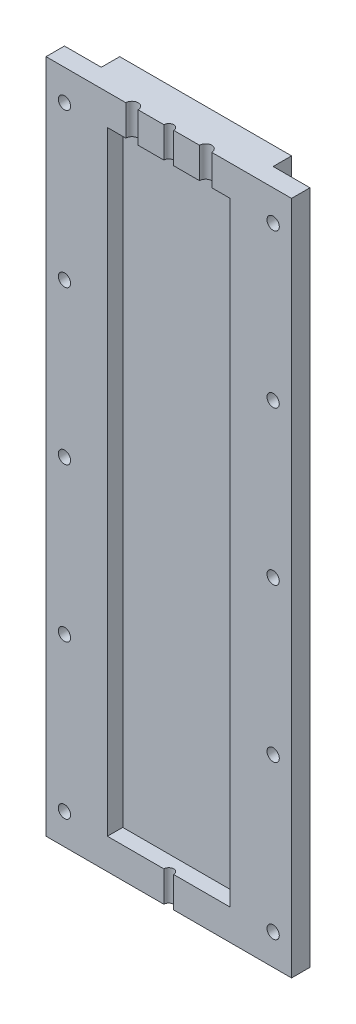
ISO-10303-21;
HEADER;
FILE_DESCRIPTION(('STEP AP214'),'2;1');
FILE_NAME('part.step','',(''),(''),'','','');
FILE_SCHEMA(('AUTOMOTIVE_DESIGN { 1 0 10303 214 1 1 1 1 }'));
ENDSEC;
DATA;
#1=APPLICATION_CONTEXT('core data for automotive mechanical design processes');
#2=APPLICATION_PROTOCOL_DEFINITION('international standard','automotive_design',2000,#1);
#3=PRODUCT_CONTEXT('',#1,'mechanical');
#4=PRODUCT('Part','Part','',(#3));
#5=PRODUCT_RELATED_PRODUCT_CATEGORY('part','',(#4));
#6=PRODUCT_DEFINITION_FORMATION('','',#4);
#7=PRODUCT_DEFINITION_CONTEXT('part definition',#1,'design');
#8=PRODUCT_DEFINITION('design','',#6,#7);
#9=PRODUCT_DEFINITION_SHAPE('','',#8);
#10=(LENGTH_UNIT() NAMED_UNIT(*) SI_UNIT(.MILLI.,.METRE.));
#11=(NAMED_UNIT(*) PLANE_ANGLE_UNIT() SI_UNIT($,.RADIAN.));
#12=(NAMED_UNIT(*) SI_UNIT($,.STERADIAN.) SOLID_ANGLE_UNIT());
#13=UNCERTAINTY_MEASURE_WITH_UNIT(LENGTH_MEASURE(1.E-05),#10,'distance_accuracy_value','');
#14=(GEOMETRIC_REPRESENTATION_CONTEXT(3) GLOBAL_UNCERTAINTY_ASSIGNED_CONTEXT((#13)) GLOBAL_UNIT_ASSIGNED_CONTEXT((#10,
#11,#12)) REPRESENTATION_CONTEXT('',''));
#15=CARTESIAN_POINT('',(0.,0.,0.));
#16=DIRECTION('',(0.,0.,1.));
#17=DIRECTION('',(1.,0.,0.));
#18=AXIS2_PLACEMENT_3D('',#15,#16,#17);
#19=CARTESIAN_POINT('',(14.,105.,0.));
#20=DIRECTION('',(0.,0.,-1.));
#21=DIRECTION('',(-1.,0.,0.));
#22=AXIS2_PLACEMENT_3D('',#19,#20,#21);
#23=PLANE('',#22);
#24=DIRECTION('',(1.,0.,0.));
#25=VECTOR('',#24,1.);
#26=CARTESIAN_POINT('',(20.,105.,0.));
#27=LINE('',#26,#25);
#28=CARTESIAN_POINT('',(0.8,105.,0.));
#29=VERTEX_POINT('',#28);
#30=CARTESIAN_POINT('',(5.,105.,0.));
#31=VERTEX_POINT('',#30);
#32=EDGE_CURVE('E207',#29,#31,#27,.T.);
#33=ORIENTED_EDGE('',*,*,#32,.T.);
#34=DIRECTION('',(0.,1.,0.));
#35=VECTOR('',#34,1.);
#36=CARTESIAN_POINT('',(5.,105.,0.));
#37=LINE('',#36,#35);
#38=CARTESIAN_POINT('',(5.,110.,0.));
#39=VERTEX_POINT('',#38);
#40=EDGE_CURVE('E183',#31,#39,#37,.T.);
#41=ORIENTED_EDGE('',*,*,#40,.T.);
#42=DIRECTION('',(1.,0.,0.));
#43=VECTOR('',#42,1.);
#44=CARTESIAN_POINT('',(10.,110.,0.));
#45=LINE('',#44,#43);
#46=CARTESIAN_POINT('',(0.8,110.,0.));
#47=VERTEX_POINT('',#46);
#48=EDGE_CURVE('E395',#47,#39,#45,.T.);
#49=ORIENTED_EDGE('',*,*,#48,.F.);
#50=DIRECTION('',(0.,-1.,0.));
#51=VECTOR('',#50,1.);
#52=CARTESIAN_POINT('',(0.8,110.,0.));
#53=LINE('',#52,#51);
#54=EDGE_CURVE('E227',#47,#29,#53,.T.);
#55=ORIENTED_EDGE('',*,*,#54,.T.);
#56=EDGE_LOOP('',(#33,#41,#49,#55));
#57=FACE_BOUND('',#56,.T.);
#58=ADVANCED_FACE('F45',(#57),#23,.F.);
#59=CARTESIAN_POINT('',(-17.0000000000003,105.,0.));
#60=DIRECTION('',(0.,0.,-1.));
#61=DIRECTION('',(-1.,0.,0.));
#62=AXIS2_PLACEMENT_3D('',#59,#60,#61);
#63=CIRCLE('',#62,1.);
#64=CARTESIAN_POINT('',(-18.0000000000003,105.,0.));
#65=VERTEX_POINT('',#64);
#66=EDGE_CURVE('E467',#65,#65,#63,.T.);
#67=ORIENTED_EDGE('',*,*,#66,.T.);
#68=EDGE_LOOP('',(#67));
#69=FACE_BOUND('',#68,.T.);
#70=CARTESIAN_POINT('',(-17.0000000000003,80.,0.));
#71=DIRECTION('',(0.,0.,-1.));
#72=DIRECTION('',(-1.,0.,0.));
#73=AXIS2_PLACEMENT_3D('',#70,#71,#72);
#74=CIRCLE('',#73,1.);
#75=CARTESIAN_POINT('',(-18.0000000000003,80.,0.));
#76=VERTEX_POINT('',#75);
#77=EDGE_CURVE('E471',#76,#76,#74,.T.);
#78=ORIENTED_EDGE('',*,*,#77,.T.);
#79=EDGE_LOOP('',(#78));
#80=FACE_BOUND('',#79,.T.);
#81=CARTESIAN_POINT('',(-17.0000000000002,55.,0.));
#82=DIRECTION('',(0.,0.,-1.));
#83=DIRECTION('',(-1.,0.,0.));
#84=AXIS2_PLACEMENT_3D('',#81,#82,#83);
#85=CIRCLE('',#84,1.);
#86=CARTESIAN_POINT('',(-18.0000000000002,55.,0.));
#87=VERTEX_POINT('',#86);
#88=EDGE_CURVE('E475',#87,#87,#85,.T.);
#89=ORIENTED_EDGE('',*,*,#88,.T.);
#90=EDGE_LOOP('',(#89));
#91=FACE_BOUND('',#90,.T.);
#92=CARTESIAN_POINT('',(-17.0000000000001,30.,0.));
#93=DIRECTION('',(0.,0.,-1.));
#94=DIRECTION('',(-1.,0.,0.));
#95=AXIS2_PLACEMENT_3D('',#92,#93,#94);
#96=CIRCLE('',#95,1.);
#97=CARTESIAN_POINT('',(-18.0000000000001,30.,0.));
#98=VERTEX_POINT('',#97);
#99=EDGE_CURVE('E479',#98,#98,#96,.T.);
#100=ORIENTED_EDGE('',*,*,#99,.T.);
#101=EDGE_LOOP('',(#100));
#102=FACE_BOUND('',#101,.T.);
#103=CARTESIAN_POINT('',(-17.,5.,0.));
#104=DIRECTION('',(0.,0.,-1.));
#105=DIRECTION('',(-1.,0.,0.));
#106=AXIS2_PLACEMENT_3D('',#103,#104,#105);
#107=CIRCLE('',#106,1.);
#108=CARTESIAN_POINT('',(-18.,5.,0.));
#109=VERTEX_POINT('',#108);
#110=EDGE_CURVE('E483',#109,#109,#107,.T.);
#111=ORIENTED_EDGE('',*,*,#110,.T.);
#112=EDGE_LOOP('',(#111));
#113=FACE_BOUND('',#112,.T.);
#114=DIRECTION('',(1.,0.,0.));
#115=VECTOR('',#114,1.);
#116=CARTESIAN_POINT('',(-0.8,105.,0.));
#117=LINE('',#116,#115);
#118=CARTESIAN_POINT('',(-10.,105.,0.));
#119=VERTEX_POINT('',#118);
#120=CARTESIAN_POINT('',(-7.,105.,0.));
#121=VERTEX_POINT('',#120);
#122=EDGE_CURVE('E218',#119,#121,#117,.T.);
#123=ORIENTED_EDGE('',*,*,#122,.T.);
#124=DIRECTION('',(0.,1.,0.));
#125=VECTOR('',#124,1.);
#126=CARTESIAN_POINT('',(-7.,105.,0.));
#127=LINE('',#126,#125);
#128=CARTESIAN_POINT('',(-7.,110.,0.));
#129=VERTEX_POINT('',#128);
#130=EDGE_CURVE('E419',#121,#129,#127,.T.);
#131=ORIENTED_EDGE('',*,*,#130,.T.);
#132=DIRECTION('',(1.,0.,0.));
#133=VECTOR('',#132,1.);
#134=CARTESIAN_POINT('',(-20.,110.,0.));
#135=LINE('',#134,#133);
#136=CARTESIAN_POINT('',(-20.,110.,0.));
#137=VERTEX_POINT('',#136);
#138=EDGE_CURVE('E228',#137,#129,#135,.T.);
#139=ORIENTED_EDGE('',*,*,#138,.F.);
#140=DIRECTION('',(0.,1.,0.));
#141=VECTOR('',#140,1.);
#142=CARTESIAN_POINT('',(-20.,0.,0.));
#143=LINE('',#142,#141);
#144=CARTESIAN_POINT('',(-20.,0.,0.));
#145=VERTEX_POINT('',#144);
#146=EDGE_CURVE('E252',#145,#137,#143,.T.);
#147=ORIENTED_EDGE('',*,*,#146,.F.);
#148=DIRECTION('',(1.,0.,0.));
#149=VECTOR('',#148,1.);
#150=CARTESIAN_POINT('',(14.,0.,0.));
#151=LINE('',#150,#149);
#152=CARTESIAN_POINT('',(-0.8,0.,0.));
#153=VERTEX_POINT('',#152);
#154=EDGE_CURVE('E316',#145,#153,#151,.T.);
#155=ORIENTED_EDGE('',*,*,#154,.T.);
#156=DIRECTION('',(0.,-1.,0.));
#157=VECTOR('',#156,1.);
#158=CARTESIAN_POINT('',(-0.8,10.,0.));
#159=LINE('',#158,#157);
#160=CARTESIAN_POINT('',(-0.8,4.99999999999999,0.));
#161=VERTEX_POINT('',#160);
#162=EDGE_CURVE('E235',#153,#161,#159,.F.);
#163=ORIENTED_EDGE('',*,*,#162,.T.);
#164=DIRECTION('',(-1.,0.,0.));
#165=VECTOR('',#164,1.);
#166=CARTESIAN_POINT('',(14.,4.99999999999999,0.));
#167=LINE('',#166,#165);
#168=CARTESIAN_POINT('',(-10.,4.99999999999999,0.));
#169=VERTEX_POINT('',#168);
#170=EDGE_CURVE('E336',#161,#169,#167,.T.);
#171=ORIENTED_EDGE('',*,*,#170,.T.);
#172=DIRECTION('',(0.,1.,0.));
#173=VECTOR('',#172,1.);
#174=CARTESIAN_POINT('',(-10.,105.,0.));
#175=LINE('',#174,#173);
#176=EDGE_CURVE('E301',#169,#119,#175,.T.);
#177=ORIENTED_EDGE('',*,*,#176,.T.);
#178=EDGE_LOOP('',(#123,#131,#139,#147,#155,#163,#171,#177));
#179=FACE_BOUND('',#178,.T.);
#180=ADVANCED_FACE('F359',(#69,#80,#91,#102,#113,#179),#23,.F.);
#181=CARTESIAN_POINT('',(17.0000000000003,105.,0.));
#182=DIRECTION('',(0.,0.,-1.));
#183=DIRECTION('',(-1.,0.,0.));
#184=AXIS2_PLACEMENT_3D('',#181,#182,#183);
#185=CIRCLE('',#184,1.);
#186=CARTESIAN_POINT('',(16.0000000000003,105.,0.));
#187=VERTEX_POINT('',#186);
#188=EDGE_CURVE('E214',#187,#187,#185,.T.);
#189=ORIENTED_EDGE('',*,*,#188,.T.);
#190=EDGE_LOOP('',(#189));
#191=FACE_BOUND('',#190,.T.);
#192=CARTESIAN_POINT('',(17.0000000000003,80.,0.));
#193=DIRECTION('',(0.,0.,-1.));
#194=DIRECTION('',(-1.,0.,0.));
#195=AXIS2_PLACEMENT_3D('',#192,#193,#194);
#196=CIRCLE('',#195,1.);
#197=CARTESIAN_POINT('',(16.0000000000003,80.,0.));
#198=VERTEX_POINT('',#197);
#199=EDGE_CURVE('E499',#198,#198,#196,.T.);
#200=ORIENTED_EDGE('',*,*,#199,.T.);
#201=EDGE_LOOP('',(#200));
#202=FACE_BOUND('',#201,.T.);
#203=CARTESIAN_POINT('',(17.0000000000002,55.,0.));
#204=DIRECTION('',(0.,0.,-1.));
#205=DIRECTION('',(-1.,0.,0.));
#206=AXIS2_PLACEMENT_3D('',#203,#204,#205);
#207=CIRCLE('',#206,1.);
#208=CARTESIAN_POINT('',(16.0000000000002,55.,0.));
#209=VERTEX_POINT('',#208);
#210=EDGE_CURVE('E495',#209,#209,#207,.T.);
#211=ORIENTED_EDGE('',*,*,#210,.T.);
#212=EDGE_LOOP('',(#211));
#213=FACE_BOUND('',#212,.T.);
#214=CARTESIAN_POINT('',(17.0000000000001,30.,0.));
#215=DIRECTION('',(0.,0.,-1.));
#216=DIRECTION('',(-1.,0.,0.));
#217=AXIS2_PLACEMENT_3D('',#214,#215,#216);
#218=CIRCLE('',#217,1.);
#219=CARTESIAN_POINT('',(16.0000000000001,30.,0.));
#220=VERTEX_POINT('',#219);
#221=EDGE_CURVE('E491',#220,#220,#218,.T.);
#222=ORIENTED_EDGE('',*,*,#221,.T.);
#223=EDGE_LOOP('',(#222));
#224=FACE_BOUND('',#223,.T.);
#225=CARTESIAN_POINT('',(17.,5.,0.));
#226=DIRECTION('',(0.,0.,-1.));
#227=DIRECTION('',(-1.,0.,0.));
#228=AXIS2_PLACEMENT_3D('',#225,#226,#227);
#229=CIRCLE('',#228,1.);
#230=CARTESIAN_POINT('',(16.,5.,0.));
#231=VERTEX_POINT('',#230);
#232=EDGE_CURVE('E487',#231,#231,#229,.T.);
#233=ORIENTED_EDGE('',*,*,#232,.T.);
#234=EDGE_LOOP('',(#233));
#235=FACE_BOUND('',#234,.T.);
#236=CARTESIAN_POINT('',(7.,110.,0.));
#237=VERTEX_POINT('',#236);
#238=CARTESIAN_POINT('',(20.,110.,0.));
#239=VERTEX_POINT('',#238);
#240=EDGE_CURVE('E198',#237,#239,#45,.T.);
#241=ORIENTED_EDGE('',*,*,#240,.F.);
#242=DIRECTION('',(0.,1.,0.));
#243=VECTOR('',#242,1.);
#244=CARTESIAN_POINT('',(7.,105.,0.));
#245=LINE('',#244,#243);
#246=CARTESIAN_POINT('',(7.,105.,0.));
#247=VERTEX_POINT('',#246);
#248=EDGE_CURVE('E68',#237,#247,#245,.F.);
#249=ORIENTED_EDGE('',*,*,#248,.T.);
#250=CARTESIAN_POINT('',(10.,105.,0.));
#251=VERTEX_POINT('',#250);
#252=EDGE_CURVE('E195',#247,#251,#27,.T.);
#253=ORIENTED_EDGE('',*,*,#252,.T.);
#254=DIRECTION('',(0.,-1.,0.));
#255=VECTOR('',#254,1.);
#256=CARTESIAN_POINT('',(10.,105.,0.));
#257=LINE('',#256,#255);
#258=CARTESIAN_POINT('',(10.,4.99999999999999,0.));
#259=VERTEX_POINT('',#258);
#260=EDGE_CURVE('E308',#251,#259,#257,.T.);
#261=ORIENTED_EDGE('',*,*,#260,.T.);
#262=CARTESIAN_POINT('',(0.8,4.99999999999999,0.));
#263=VERTEX_POINT('',#262);
#264=EDGE_CURVE('E337',#259,#263,#167,.T.);
#265=ORIENTED_EDGE('',*,*,#264,.T.);
#266=DIRECTION('',(0.,-1.,0.));
#267=VECTOR('',#266,1.);
#268=CARTESIAN_POINT('',(0.8,10.,0.));
#269=LINE('',#268,#267);
#270=CARTESIAN_POINT('',(0.8,0.,0.));
#271=VERTEX_POINT('',#270);
#272=EDGE_CURVE('E239',#263,#271,#269,.T.);
#273=ORIENTED_EDGE('',*,*,#272,.T.);
#274=CARTESIAN_POINT('',(20.,0.,0.));
#275=VERTEX_POINT('',#274);
#276=EDGE_CURVE('E315',#271,#275,#151,.T.);
#277=ORIENTED_EDGE('',*,*,#276,.T.);
#278=DIRECTION('',(0.,1.,0.));
#279=VECTOR('',#278,1.);
#280=CARTESIAN_POINT('',(20.,0.,0.));
#281=LINE('',#280,#279);
#282=EDGE_CURVE('E268',#275,#239,#281,.T.);
#283=ORIENTED_EDGE('',*,*,#282,.T.);
#284=EDGE_LOOP('',(#241,#249,#253,#261,#265,#273,#277,#283));
#285=FACE_BOUND('',#284,.T.);
#286=ADVANCED_FACE('F193',(#191,#202,#213,#224,#235,#285),#23,.F.);
#287=CARTESIAN_POINT('',(14.,105.,0.));
#288=DIRECTION('',(-1.,0.,0.));
#289=DIRECTION('',(0.,0.,1.));
#290=AXIS2_PLACEMENT_3D('',#287,#288,#289);
#291=PLANE('',#290);
#292=DIRECTION('',(0.,1.,0.));
#293=VECTOR('',#292,1.);
#294=CARTESIAN_POINT('',(14.,0.,-3.));
#295=LINE('',#294,#293);
#296=CARTESIAN_POINT('',(14.,0.,-3.));
#297=VERTEX_POINT('',#296);
#298=CARTESIAN_POINT('',(14.,110.,-3.));
#299=VERTEX_POINT('',#298);
#300=EDGE_CURVE('E269',#297,#299,#295,.T.);
#301=ORIENTED_EDGE('',*,*,#300,.F.);
#302=DIRECTION('',(0.,0.,-1.));
#303=VECTOR('',#302,1.);
#304=CARTESIAN_POINT('',(14.,0.,0.));
#305=LINE('',#304,#303);
#306=CARTESIAN_POINT('',(14.,0.,-6.));
#307=VERTEX_POINT('',#306);
#308=EDGE_CURVE('E320',#297,#307,#305,.T.);
#309=ORIENTED_EDGE('',*,*,#308,.T.);
#310=DIRECTION('',(0.,-1.,0.));
#311=VECTOR('',#310,1.);
#312=CARTESIAN_POINT('',(14.,105.,-6.));
#313=LINE('',#312,#311);
#314=CARTESIAN_POINT('',(14.,110.,-6.));
#315=VERTEX_POINT('',#314);
#316=EDGE_CURVE('E330',#315,#307,#313,.T.);
#317=ORIENTED_EDGE('',*,*,#316,.F.);
#318=DIRECTION('',(0.,0.,-1.));
#319=VECTOR('',#318,1.);
#320=CARTESIAN_POINT('',(14.,110.,-6.));
#321=LINE('',#320,#319);
#322=EDGE_CURVE('E383',#299,#315,#321,.T.);
#323=ORIENTED_EDGE('',*,*,#322,.F.);
#324=EDGE_LOOP('',(#301,#309,#317,#323));
#325=FACE_BOUND('',#324,.T.);
#326=ADVANCED_FACE('F540',(#325),#291,.F.);
#327=CARTESIAN_POINT('',(-14.,105.,0.));
#328=DIRECTION('',(1.,0.,0.));
#329=DIRECTION('',(0.,0.,-1.));
#330=AXIS2_PLACEMENT_3D('',#327,#328,#329);
#331=PLANE('',#330);
#332=DIRECTION('',(0.,0.,1.));
#333=VECTOR('',#332,1.);
#334=CARTESIAN_POINT('',(-14.,0.,0.));
#335=LINE('',#334,#333);
#336=CARTESIAN_POINT('',(-14.,0.,-6.));
#337=VERTEX_POINT('',#336);
#338=CARTESIAN_POINT('',(-14.,0.,-3.));
#339=VERTEX_POINT('',#338);
#340=EDGE_CURVE('E311',#337,#339,#335,.T.);
#341=ORIENTED_EDGE('',*,*,#340,.T.);
#342=DIRECTION('',(0.,1.,0.));
#343=VECTOR('',#342,1.);
#344=CARTESIAN_POINT('',(-14.,0.,-3.));
#345=LINE('',#344,#343);
#346=CARTESIAN_POINT('',(-14.,110.,-3.));
#347=VERTEX_POINT('',#346);
#348=EDGE_CURVE('E251',#339,#347,#345,.T.);
#349=ORIENTED_EDGE('',*,*,#348,.T.);
#350=DIRECTION('',(0.,0.,1.));
#351=VECTOR('',#350,1.);
#352=CARTESIAN_POINT('',(-14.,110.,-3.));
#353=LINE('',#352,#351);
#354=CARTESIAN_POINT('',(-14.,110.,-6.));
#355=VERTEX_POINT('',#354);
#356=EDGE_CURVE('E375',#355,#347,#353,.T.);
#357=ORIENTED_EDGE('',*,*,#356,.F.);
#358=DIRECTION('',(0.,-1.,0.));
#359=VECTOR('',#358,1.);
#360=CARTESIAN_POINT('',(-14.,105.,-6.));
#361=LINE('',#360,#359);
#362=EDGE_CURVE('E326',#355,#337,#361,.T.);
#363=ORIENTED_EDGE('',*,*,#362,.T.);
#364=EDGE_LOOP('',(#341,#349,#357,#363));
#365=FACE_BOUND('',#364,.T.);
#366=ADVANCED_FACE('F47',(#365),#331,.F.);
#367=CARTESIAN_POINT('',(-5.,110.,0.));
#368=VERTEX_POINT('',#367);
#369=CARTESIAN_POINT('',(-0.8,110.,0.));
#370=VERTEX_POINT('',#369);
#371=EDGE_CURVE('E366',#368,#370,#135,.T.);
#372=ORIENTED_EDGE('',*,*,#371,.F.);
#373=DIRECTION('',(0.,1.,0.));
#374=VECTOR('',#373,1.);
#375=CARTESIAN_POINT('',(-5.,105.,0.));
#376=LINE('',#375,#374);
#377=CARTESIAN_POINT('',(-5.,105.,0.));
#378=VERTEX_POINT('',#377);
#379=EDGE_CURVE('E61',#368,#378,#376,.F.);
#380=ORIENTED_EDGE('',*,*,#379,.T.);
#381=CARTESIAN_POINT('',(-0.8,105.,0.));
#382=VERTEX_POINT('',#381);
#383=EDGE_CURVE('E212',#378,#382,#117,.T.);
#384=ORIENTED_EDGE('',*,*,#383,.T.);
#385=DIRECTION('',(0.,-1.,0.));
#386=VECTOR('',#385,1.);
#387=CARTESIAN_POINT('',(-0.8,110.,0.));
#388=LINE('',#387,#386);
#389=EDGE_CURVE('E223',#370,#382,#388,.T.);
#390=ORIENTED_EDGE('',*,*,#389,.F.);
#391=EDGE_LOOP('',(#372,#380,#384,#390));
#392=FACE_BOUND('',#391,.T.);
#393=ADVANCED_FACE('F408',(#392),#23,.F.);
#394=CARTESIAN_POINT('',(14.,105.,-6.));
#395=DIRECTION('',(0.,0.,1.));
#396=DIRECTION('',(1.,0.,0.));
#397=AXIS2_PLACEMENT_3D('',#394,#395,#396);
#398=PLANE('',#397);
#399=DIRECTION('',(-1.,0.,0.));
#400=VECTOR('',#399,1.);
#401=CARTESIAN_POINT('',(14.,0.,-6.));
#402=LINE('',#401,#400);
#403=EDGE_CURVE('E323',#307,#337,#402,.T.);
#404=ORIENTED_EDGE('',*,*,#403,.T.);
#405=ORIENTED_EDGE('',*,*,#362,.F.);
#406=DIRECTION('',(-1.,0.,0.));
#407=VECTOR('',#406,1.);
#408=CARTESIAN_POINT('',(-14.,110.,-6.));
#409=LINE('',#408,#407);
#410=EDGE_CURVE('E379',#315,#355,#409,.T.);
#411=ORIENTED_EDGE('',*,*,#410,.F.);
#412=ORIENTED_EDGE('',*,*,#316,.T.);
#413=EDGE_LOOP('',(#404,#405,#411,#412));
#414=FACE_BOUND('',#413,.T.);
#415=ADVANCED_FACE('F530',(#414),#398,.F.);
#416=CARTESIAN_POINT('',(0.,0.,0.));
#417=DIRECTION('',(0.,1.,0.));
#418=DIRECTION('',(0.,0.,1.));
#419=AXIS2_PLACEMENT_3D('',#416,#417,#418);
#420=PLANE('',#419);
#421=ORIENTED_EDGE('',*,*,#276,.F.);
#422=CARTESIAN_POINT('',(0.,0.,0.));
#423=DIRECTION('',(0.,-1.,0.));
#424=DIRECTION('',(0.,0.,-1.));
#425=AXIS2_PLACEMENT_3D('',#422,#423,#424);
#426=CIRCLE('',#425,0.8);
#427=EDGE_CURVE('E232',#153,#271,#426,.T.);
#428=ORIENTED_EDGE('',*,*,#427,.F.);
#429=ORIENTED_EDGE('',*,*,#154,.F.);
#430=DIRECTION('',(0.,0.,1.));
#431=VECTOR('',#430,1.);
#432=CARTESIAN_POINT('',(-20.,0.,0.));
#433=LINE('',#432,#431);
#434=CARTESIAN_POINT('',(-20.,0.,-3.));
#435=VERTEX_POINT('',#434);
#436=EDGE_CURVE('E247',#435,#145,#433,.T.);
#437=ORIENTED_EDGE('',*,*,#436,.F.);
#438=DIRECTION('',(-1.,0.,0.));
#439=VECTOR('',#438,1.);
#440=CARTESIAN_POINT('',(-14.,0.,-3.));
#441=LINE('',#440,#439);
#442=EDGE_CURVE('E243',#339,#435,#441,.T.);
#443=ORIENTED_EDGE('',*,*,#442,.F.);
#444=ORIENTED_EDGE('',*,*,#340,.F.);
#445=ORIENTED_EDGE('',*,*,#403,.F.);
#446=ORIENTED_EDGE('',*,*,#308,.F.);
#447=DIRECTION('',(-1.,0.,0.));
#448=VECTOR('',#447,1.);
#449=CARTESIAN_POINT('',(14.,0.,-3.));
#450=LINE('',#449,#448);
#451=CARTESIAN_POINT('',(20.,0.,-3.));
#452=VERTEX_POINT('',#451);
#453=EDGE_CURVE('E264',#452,#297,#450,.T.);
#454=ORIENTED_EDGE('',*,*,#453,.F.);
#455=DIRECTION('',(0.,0.,-1.));
#456=VECTOR('',#455,1.);
#457=CARTESIAN_POINT('',(20.,0.,0.));
#458=LINE('',#457,#456);
#459=EDGE_CURVE('E255',#275,#452,#458,.T.);
#460=ORIENTED_EDGE('',*,*,#459,.F.);
#461=EDGE_LOOP('',(#421,#428,#429,#437,#443,#444,#445,#446,#454,#460));
#462=FACE_BOUND('',#461,.T.);
#463=ADVANCED_FACE('F536',(#462),#420,.F.);
#464=CARTESIAN_POINT('',(0.,4.99999999999999,0.));
#465=DIRECTION('',(0.,-1.,0.));
#466=DIRECTION('',(0.,0.,-1.));
#467=AXIS2_PLACEMENT_3D('',#464,#465,#466);
#468=PLANE('',#467);
#469=ORIENTED_EDGE('',*,*,#170,.F.);
#470=CARTESIAN_POINT('',(0.,4.99999999999999,0.));
#471=DIRECTION('',(0.,-1.,0.));
#472=DIRECTION('',(0.,0.,-1.));
#473=AXIS2_PLACEMENT_3D('',#470,#471,#472);
#474=CIRCLE('',#473,0.8);
#475=EDGE_CURVE('E54',#161,#263,#474,.T.);
#476=ORIENTED_EDGE('',*,*,#475,.T.);
#477=ORIENTED_EDGE('',*,*,#264,.F.);
#478=DIRECTION('',(0.,0.,-1.));
#479=VECTOR('',#478,1.);
#480=CARTESIAN_POINT('',(10.,4.99999999999999,2.5));
#481=LINE('',#480,#479);
#482=CARTESIAN_POINT('',(10.,4.99999999999999,-2.5));
#483=VERTEX_POINT('',#482);
#484=EDGE_CURVE('E278',#259,#483,#481,.T.);
#485=ORIENTED_EDGE('',*,*,#484,.T.);
#486=DIRECTION('',(-1.,0.,0.));
#487=VECTOR('',#486,1.);
#488=CARTESIAN_POINT('',(-10.,4.99999999999999,-2.5));
#489=LINE('',#488,#487);
#490=CARTESIAN_POINT('',(-10.,4.99999999999999,-2.5));
#491=VERTEX_POINT('',#490);
#492=EDGE_CURVE('E281',#483,#491,#489,.T.);
#493=ORIENTED_EDGE('',*,*,#492,.T.);
#494=DIRECTION('',(0.,0.,1.));
#495=VECTOR('',#494,1.);
#496=CARTESIAN_POINT('',(-10.,4.99999999999999,2.5));
#497=LINE('',#496,#495);
#498=EDGE_CURVE('E286',#491,#169,#497,.T.);
#499=ORIENTED_EDGE('',*,*,#498,.T.);
#500=EDGE_LOOP('',(#469,#476,#477,#485,#493,#499));
#501=FACE_BOUND('',#500,.T.);
#502=ADVANCED_FACE('F344',(#501),#468,.F.);
#503=CARTESIAN_POINT('',(10.,4.99999999999999,2.5));
#504=DIRECTION('',(1.,0.,0.));
#505=DIRECTION('',(0.,0.,-1.));
#506=AXIS2_PLACEMENT_3D('',#503,#504,#505);
#507=PLANE('',#506);
#508=DIRECTION('',(0.,0.,-1.));
#509=VECTOR('',#508,1.);
#510=CARTESIAN_POINT('',(10.,105.,0.));
#511=LINE('',#510,#509);
#512=CARTESIAN_POINT('',(10.,105.,-2.5));
#513=VERTEX_POINT('',#512);
#514=EDGE_CURVE('E204',#251,#513,#511,.T.);
#515=ORIENTED_EDGE('',*,*,#514,.T.);
#516=DIRECTION('',(0.,1.,0.));
#517=VECTOR('',#516,1.);
#518=CARTESIAN_POINT('',(10.,4.99999999999999,-2.5));
#519=LINE('',#518,#517);
#520=EDGE_CURVE('E290',#483,#513,#519,.T.);
#521=ORIENTED_EDGE('',*,*,#520,.F.);
#522=ORIENTED_EDGE('',*,*,#484,.F.);
#523=ORIENTED_EDGE('',*,*,#260,.F.);
#524=EDGE_LOOP('',(#515,#521,#522,#523));
#525=FACE_BOUND('',#524,.T.);
#526=ADVANCED_FACE('F349',(#525),#507,.F.);
#527=CARTESIAN_POINT('',(-10.,4.99999999999999,2.5));
#528=DIRECTION('',(-1.,0.,0.));
#529=DIRECTION('',(0.,0.,1.));
#530=AXIS2_PLACEMENT_3D('',#527,#528,#529);
#531=PLANE('',#530);
#532=ORIENTED_EDGE('',*,*,#498,.F.);
#533=DIRECTION('',(0.,1.,0.));
#534=VECTOR('',#533,1.);
#535=CARTESIAN_POINT('',(-10.,4.99999999999999,-2.5));
#536=LINE('',#535,#534);
#537=CARTESIAN_POINT('',(-10.,105.,-2.5));
#538=VERTEX_POINT('',#537);
#539=EDGE_CURVE('E297',#491,#538,#536,.T.);
#540=ORIENTED_EDGE('',*,*,#539,.T.);
#541=DIRECTION('',(0.,0.,1.));
#542=VECTOR('',#541,1.);
#543=CARTESIAN_POINT('',(-10.,105.,2.5));
#544=LINE('',#543,#542);
#545=EDGE_CURVE('E282',#538,#119,#544,.T.);
#546=ORIENTED_EDGE('',*,*,#545,.T.);
#547=ORIENTED_EDGE('',*,*,#176,.F.);
#548=EDGE_LOOP('',(#532,#540,#546,#547));
#549=FACE_BOUND('',#548,.T.);
#550=ADVANCED_FACE('F357',(#549),#531,.F.);
#551=CARTESIAN_POINT('',(-10.,4.99999999999999,-2.5));
#552=DIRECTION('',(0.,0.,-1.));
#553=DIRECTION('',(-1.,0.,0.));
#554=AXIS2_PLACEMENT_3D('',#551,#552,#553);
#555=PLANE('',#554);
#556=DIRECTION('',(-1.,0.,0.));
#557=VECTOR('',#556,1.);
#558=CARTESIAN_POINT('',(-10.,105.,-2.5));
#559=LINE('',#558,#557);
#560=EDGE_CURVE('E272',#513,#538,#559,.T.);
#561=ORIENTED_EDGE('',*,*,#560,.T.);
#562=ORIENTED_EDGE('',*,*,#539,.F.);
#563=ORIENTED_EDGE('',*,*,#492,.F.);
#564=ORIENTED_EDGE('',*,*,#520,.T.);
#565=EDGE_LOOP('',(#561,#562,#563,#564));
#566=FACE_BOUND('',#565,.T.);
#567=ADVANCED_FACE('F354',(#566),#555,.F.);
#568=CARTESIAN_POINT('',(14.,0.,-3.));
#569=DIRECTION('',(0.,0.,-1.));
#570=DIRECTION('',(-1.,0.,0.));
#571=AXIS2_PLACEMENT_3D('',#568,#569,#570);
#572=PLANE('',#571);
#573=CARTESIAN_POINT('',(17.0000000000003,105.,-3.));
#574=DIRECTION('',(0.,0.,-1.));
#575=DIRECTION('',(-1.,0.,0.));
#576=AXIS2_PLACEMENT_3D('',#573,#574,#575);
#577=CIRCLE('',#576,1.);
#578=CARTESIAN_POINT('',(16.0000000000003,105.,-3.));
#579=VERTEX_POINT('',#578);
#580=EDGE_CURVE('E445',#579,#579,#577,.T.);
#581=ORIENTED_EDGE('',*,*,#580,.F.);
#582=EDGE_LOOP('',(#581));
#583=FACE_BOUND('',#582,.T.);
#584=CARTESIAN_POINT('',(17.0000000000003,80.,-3.));
#585=DIRECTION('',(0.,0.,-1.));
#586=DIRECTION('',(-1.,0.,0.));
#587=AXIS2_PLACEMENT_3D('',#584,#585,#586);
#588=CIRCLE('',#587,1.);
#589=CARTESIAN_POINT('',(16.0000000000003,80.,-3.));
#590=VERTEX_POINT('',#589);
#591=EDGE_CURVE('E441',#590,#590,#588,.T.);
#592=ORIENTED_EDGE('',*,*,#591,.F.);
#593=EDGE_LOOP('',(#592));
#594=FACE_BOUND('',#593,.T.);
#595=CARTESIAN_POINT('',(17.0000000000002,55.,-3.));
#596=DIRECTION('',(0.,0.,-1.));
#597=DIRECTION('',(-1.,0.,0.));
#598=AXIS2_PLACEMENT_3D('',#595,#596,#597);
#599=CIRCLE('',#598,1.);
#600=CARTESIAN_POINT('',(16.0000000000002,55.,-3.));
#601=VERTEX_POINT('',#600);
#602=EDGE_CURVE('E437',#601,#601,#599,.T.);
#603=ORIENTED_EDGE('',*,*,#602,.F.);
#604=EDGE_LOOP('',(#603));
#605=FACE_BOUND('',#604,.T.);
#606=CARTESIAN_POINT('',(17.0000000000001,30.,-3.));
#607=DIRECTION('',(0.,0.,-1.));
#608=DIRECTION('',(-1.,0.,0.));
#609=AXIS2_PLACEMENT_3D('',#606,#607,#608);
#610=CIRCLE('',#609,1.);
#611=CARTESIAN_POINT('',(16.0000000000001,30.,-3.));
#612=VERTEX_POINT('',#611);
#613=EDGE_CURVE('E432',#612,#612,#610,.T.);
#614=ORIENTED_EDGE('',*,*,#613,.F.);
#615=EDGE_LOOP('',(#614));
#616=FACE_BOUND('',#615,.T.);
#617=CARTESIAN_POINT('',(17.,5.,-3.));
#618=DIRECTION('',(0.,0.,-1.));
#619=DIRECTION('',(-1.,0.,0.));
#620=AXIS2_PLACEMENT_3D('',#617,#618,#619);
#621=CIRCLE('',#620,1.);
#622=CARTESIAN_POINT('',(16.,5.,-3.));
#623=VERTEX_POINT('',#622);
#624=EDGE_CURVE('E436',#623,#623,#621,.T.);
#625=ORIENTED_EDGE('',*,*,#624,.F.);
#626=EDGE_LOOP('',(#625));
#627=FACE_BOUND('',#626,.T.);
#628=ORIENTED_EDGE('',*,*,#300,.T.);
#629=DIRECTION('',(-1.,0.,0.));
#630=VECTOR('',#629,1.);
#631=CARTESIAN_POINT('',(14.,110.,-3.));
#632=LINE('',#631,#630);
#633=CARTESIAN_POINT('',(20.,110.,-3.));
#634=VERTEX_POINT('',#633);
#635=EDGE_CURVE('E387',#634,#299,#632,.T.);
#636=ORIENTED_EDGE('',*,*,#635,.F.);
#637=DIRECTION('',(0.,1.,0.));
#638=VECTOR('',#637,1.);
#639=CARTESIAN_POINT('',(20.,0.,-3.));
#640=LINE('',#639,#638);
#641=EDGE_CURVE('E273',#452,#634,#640,.T.);
#642=ORIENTED_EDGE('',*,*,#641,.F.);
#643=ORIENTED_EDGE('',*,*,#453,.T.);
#644=EDGE_LOOP('',(#628,#636,#642,#643));
#645=FACE_BOUND('',#644,.T.);
#646=ADVANCED_FACE('F557',(#583,#594,#605,#616,#627,#645),#572,.T.);
#647=CARTESIAN_POINT('',(20.,0.,0.));
#648=DIRECTION('',(1.,0.,0.));
#649=DIRECTION('',(0.,0.,-1.));
#650=AXIS2_PLACEMENT_3D('',#647,#648,#649);
#651=PLANE('',#650);
#652=ORIENTED_EDGE('',*,*,#641,.T.);
#653=DIRECTION('',(0.,0.,-1.));
#654=VECTOR('',#653,1.);
#655=CARTESIAN_POINT('',(20.,110.,-3.));
#656=LINE('',#655,#654);
#657=EDGE_CURVE('E391',#239,#634,#656,.T.);
#658=ORIENTED_EDGE('',*,*,#657,.F.);
#659=ORIENTED_EDGE('',*,*,#282,.F.);
#660=ORIENTED_EDGE('',*,*,#459,.T.);
#661=EDGE_LOOP('',(#652,#658,#659,#660));
#662=FACE_BOUND('',#661,.T.);
#663=ADVANCED_FACE('F562',(#662),#651,.T.);
#664=CARTESIAN_POINT('',(-20.,0.,0.));
#665=DIRECTION('',(-1.,0.,0.));
#666=DIRECTION('',(0.,0.,1.));
#667=AXIS2_PLACEMENT_3D('',#664,#665,#666);
#668=PLANE('',#667);
#669=ORIENTED_EDGE('',*,*,#146,.T.);
#670=DIRECTION('',(0.,0.,1.));
#671=VECTOR('',#670,1.);
#672=CARTESIAN_POINT('',(-20.,110.,-3.));
#673=LINE('',#672,#671);
#674=CARTESIAN_POINT('',(-20.,110.,-3.));
#675=VERTEX_POINT('',#674);
#676=EDGE_CURVE('E368',#675,#137,#673,.T.);
#677=ORIENTED_EDGE('',*,*,#676,.F.);
#678=DIRECTION('',(0.,1.,0.));
#679=VECTOR('',#678,1.);
#680=CARTESIAN_POINT('',(-20.,0.,-3.));
#681=LINE('',#680,#679);
#682=EDGE_CURVE('E256',#435,#675,#681,.T.);
#683=ORIENTED_EDGE('',*,*,#682,.F.);
#684=ORIENTED_EDGE('',*,*,#436,.T.);
#685=EDGE_LOOP('',(#669,#677,#683,#684));
#686=FACE_BOUND('',#685,.T.);
#687=ADVANCED_FACE('F565',(#686),#668,.T.);
#688=CARTESIAN_POINT('',(-14.,0.,-3.));
#689=DIRECTION('',(0.,0.,-1.));
#690=DIRECTION('',(-1.,0.,0.));
#691=AXIS2_PLACEMENT_3D('',#688,#689,#690);
#692=PLANE('',#691);
#693=CARTESIAN_POINT('',(-17.,5.,-3.));
#694=DIRECTION('',(0.,0.,-1.));
#695=DIRECTION('',(1.,0.,0.));
#696=AXIS2_PLACEMENT_3D('',#693,#694,#695);
#697=CIRCLE('',#696,1.);
#698=CARTESIAN_POINT('',(-16.,5.,-3.));
#699=VERTEX_POINT('',#698);
#700=EDGE_CURVE('E422',#699,#699,#697,.T.);
#701=ORIENTED_EDGE('',*,*,#700,.F.);
#702=EDGE_LOOP('',(#701));
#703=FACE_BOUND('',#702,.T.);
#704=CARTESIAN_POINT('',(-17.0000000000001,30.,-3.));
#705=DIRECTION('',(0.,0.,-1.));
#706=DIRECTION('',(1.,0.,0.));
#707=AXIS2_PLACEMENT_3D('',#704,#705,#706);
#708=CIRCLE('',#707,1.);
#709=CARTESIAN_POINT('',(-16.0000000000001,30.,-3.));
#710=VERTEX_POINT('',#709);
#711=EDGE_CURVE('E427',#710,#710,#708,.T.);
#712=ORIENTED_EDGE('',*,*,#711,.F.);
#713=EDGE_LOOP('',(#712));
#714=FACE_BOUND('',#713,.T.);
#715=CARTESIAN_POINT('',(-17.0000000000002,55.,-3.));
#716=DIRECTION('',(0.,0.,-1.));
#717=DIRECTION('',(1.,0.,0.));
#718=AXIS2_PLACEMENT_3D('',#715,#716,#717);
#719=CIRCLE('',#718,1.);
#720=CARTESIAN_POINT('',(-16.0000000000002,55.,-3.));
#721=VERTEX_POINT('',#720);
#722=EDGE_CURVE('E457',#721,#721,#719,.T.);
#723=ORIENTED_EDGE('',*,*,#722,.F.);
#724=EDGE_LOOP('',(#723));
#725=FACE_BOUND('',#724,.T.);
#726=CARTESIAN_POINT('',(-17.0000000000003,80.,-3.));
#727=DIRECTION('',(0.,0.,-1.));
#728=DIRECTION('',(1.,0.,0.));
#729=AXIS2_PLACEMENT_3D('',#726,#727,#728);
#730=CIRCLE('',#729,1.);
#731=CARTESIAN_POINT('',(-16.0000000000003,80.,-3.));
#732=VERTEX_POINT('',#731);
#733=EDGE_CURVE('E453',#732,#732,#730,.T.);
#734=ORIENTED_EDGE('',*,*,#733,.F.);
#735=EDGE_LOOP('',(#734));
#736=FACE_BOUND('',#735,.T.);
#737=CARTESIAN_POINT('',(-17.0000000000003,105.,-3.));
#738=DIRECTION('',(0.,0.,-1.));
#739=DIRECTION('',(1.,0.,0.));
#740=AXIS2_PLACEMENT_3D('',#737,#738,#739);
#741=CIRCLE('',#740,1.);
#742=CARTESIAN_POINT('',(-16.0000000000003,105.,-3.));
#743=VERTEX_POINT('',#742);
#744=EDGE_CURVE('E449',#743,#743,#741,.T.);
#745=ORIENTED_EDGE('',*,*,#744,.F.);
#746=EDGE_LOOP('',(#745));
#747=FACE_BOUND('',#746,.T.);
#748=ORIENTED_EDGE('',*,*,#682,.T.);
#749=DIRECTION('',(-1.,0.,0.));
#750=VECTOR('',#749,1.);
#751=CARTESIAN_POINT('',(-20.,110.,-3.));
#752=LINE('',#751,#750);
#753=EDGE_CURVE('E371',#347,#675,#752,.T.);
#754=ORIENTED_EDGE('',*,*,#753,.F.);
#755=ORIENTED_EDGE('',*,*,#348,.F.);
#756=ORIENTED_EDGE('',*,*,#442,.T.);
#757=EDGE_LOOP('',(#748,#754,#755,#756));
#758=FACE_BOUND('',#757,.T.);
#759=ADVANCED_FACE('F570',(#703,#714,#725,#736,#747,#758),#692,.T.);
#760=CARTESIAN_POINT('',(0.,10.,0.));
#761=DIRECTION('',(0.,-1.,0.));
#762=DIRECTION('',(0.,0.,-1.));
#763=AXIS2_PLACEMENT_3D('',#760,#761,#762);
#764=CYLINDRICAL_SURFACE('',#763,0.8);
#765=ORIENTED_EDGE('',*,*,#475,.F.);
#766=ORIENTED_EDGE('',*,*,#162,.F.);
#767=ORIENTED_EDGE('',*,*,#427,.T.);
#768=ORIENTED_EDGE('',*,*,#272,.F.);
#769=EDGE_LOOP('',(#765,#766,#767,#768));
#770=FACE_BOUND('',#769,.T.);
#771=ADVANCED_FACE('F573',(#770),#764,.F.);
#772=CARTESIAN_POINT('',(0.,105.,0.));
#773=DIRECTION('',(0.,-1.,0.));
#774=DIRECTION('',(0.,0.,-1.));
#775=AXIS2_PLACEMENT_3D('',#772,#773,#774);
#776=PLANE('',#775);
#777=CARTESIAN_POINT('',(-6.,105.,0.));
#778=DIRECTION('',(0.,1.,0.));
#779=DIRECTION('',(0.,0.,-1.));
#780=AXIS2_PLACEMENT_3D('',#777,#778,#779);
#781=CIRCLE('',#780,1.);
#782=EDGE_CURVE('E188',#378,#121,#781,.T.);
#783=ORIENTED_EDGE('',*,*,#782,.T.);
#784=ORIENTED_EDGE('',*,*,#122,.F.);
#785=ORIENTED_EDGE('',*,*,#545,.F.);
#786=ORIENTED_EDGE('',*,*,#560,.F.);
#787=ORIENTED_EDGE('',*,*,#514,.F.);
#788=ORIENTED_EDGE('',*,*,#252,.F.);
#789=CARTESIAN_POINT('',(6.,105.,0.));
#790=DIRECTION('',(0.,1.,0.));
#791=DIRECTION('',(0.,0.,1.));
#792=AXIS2_PLACEMENT_3D('',#789,#790,#791);
#793=CIRCLE('',#792,1.);
#794=EDGE_CURVE('E180',#247,#31,#793,.T.);
#795=ORIENTED_EDGE('',*,*,#794,.T.);
#796=ORIENTED_EDGE('',*,*,#32,.F.);
#797=CARTESIAN_POINT('',(0.,105.,0.));
#798=DIRECTION('',(0.,-1.,0.));
#799=DIRECTION('',(0.,0.,-1.));
#800=AXIS2_PLACEMENT_3D('',#797,#798,#799);
#801=CIRCLE('',#800,0.8);
#802=EDGE_CURVE('E208',#382,#29,#801,.T.);
#803=ORIENTED_EDGE('',*,*,#802,.F.);
#804=ORIENTED_EDGE('',*,*,#383,.F.);
#805=EDGE_LOOP('',(#783,#784,#785,#786,#787,#788,#795,#796,#803,#804));
#806=FACE_BOUND('',#805,.T.);
#807=ADVANCED_FACE('F202',(#806),#776,.T.);
#808=CARTESIAN_POINT('',(0.,110.,0.));
#809=DIRECTION('',(0.,-1.,0.));
#810=DIRECTION('',(0.,0.,-1.));
#811=AXIS2_PLACEMENT_3D('',#808,#809,#810);
#812=CYLINDRICAL_SURFACE('',#811,0.8);
#813=ORIENTED_EDGE('',*,*,#802,.T.);
#814=ORIENTED_EDGE('',*,*,#54,.F.);
#815=CARTESIAN_POINT('',(0.,110.,0.));
#816=DIRECTION('',(0.,-1.,0.));
#817=DIRECTION('',(0.,0.,-1.));
#818=AXIS2_PLACEMENT_3D('',#815,#816,#817);
#819=CIRCLE('',#818,0.8);
#820=EDGE_CURVE('E222',#370,#47,#819,.T.);
#821=ORIENTED_EDGE('',*,*,#820,.F.);
#822=ORIENTED_EDGE('',*,*,#389,.T.);
#823=EDGE_LOOP('',(#813,#814,#821,#822));
#824=FACE_BOUND('',#823,.T.);
#825=ADVANCED_FACE('F412',(#824),#812,.F.);
#826=CARTESIAN_POINT('',(0.,110.,0.));
#827=DIRECTION('',(0.,-1.,0.));
#828=DIRECTION('',(0.,0.,-1.));
#829=AXIS2_PLACEMENT_3D('',#826,#827,#828);
#830=PLANE('',#829);
#831=ORIENTED_EDGE('',*,*,#138,.T.);
#832=CARTESIAN_POINT('',(-6.,110.,0.));
#833=DIRECTION('',(0.,-1.,0.));
#834=DIRECTION('',(0.,0.,-1.));
#835=AXIS2_PLACEMENT_3D('',#832,#833,#834);
#836=CIRCLE('',#835,1.);
#837=EDGE_CURVE('E11',#129,#368,#836,.T.);
#838=ORIENTED_EDGE('',*,*,#837,.T.);
#839=ORIENTED_EDGE('',*,*,#371,.T.);
#840=ORIENTED_EDGE('',*,*,#820,.T.);
#841=ORIENTED_EDGE('',*,*,#48,.T.);
#842=CARTESIAN_POINT('',(6.,110.,0.));
#843=DIRECTION('',(0.,1.,0.));
#844=DIRECTION('',(0.,0.,1.));
#845=AXIS2_PLACEMENT_3D('',#842,#843,#844);
#846=CIRCLE('',#845,1.);
#847=EDGE_CURVE('E189',#237,#39,#846,.T.);
#848=ORIENTED_EDGE('',*,*,#847,.F.);
#849=ORIENTED_EDGE('',*,*,#240,.T.);
#850=ORIENTED_EDGE('',*,*,#657,.T.);
#851=ORIENTED_EDGE('',*,*,#635,.T.);
#852=ORIENTED_EDGE('',*,*,#322,.T.);
#853=ORIENTED_EDGE('',*,*,#410,.T.);
#854=ORIENTED_EDGE('',*,*,#356,.T.);
#855=ORIENTED_EDGE('',*,*,#753,.T.);
#856=ORIENTED_EDGE('',*,*,#676,.T.);
#857=EDGE_LOOP('',(#831,#838,#839,#840,#841,#848,#849,#850,#851,#852,#853,#854,#855,#856));
#858=FACE_BOUND('',#857,.T.);
#859=ADVANCED_FACE('F416',(#858),#830,.F.);
#860=CARTESIAN_POINT('',(-17.0000000000003,105.,7.));
#861=DIRECTION('',(0.,0.,-1.));
#862=DIRECTION('',(-1.,0.,0.));
#863=AXIS2_PLACEMENT_3D('',#860,#861,#862);
#864=CYLINDRICAL_SURFACE('',#863,1.);
#865=ORIENTED_EDGE('',*,*,#744,.T.);
#866=EDGE_LOOP('',(#865));
#867=FACE_BOUND('',#866,.T.);
#868=ORIENTED_EDGE('',*,*,#66,.F.);
#869=EDGE_LOOP('',(#868));
#870=FACE_BOUND('',#869,.T.);
#871=ADVANCED_FACE('F584',(#867,#870),#864,.F.);
#872=CARTESIAN_POINT('',(-17.0000000000003,80.,7.));
#873=DIRECTION('',(0.,0.,-1.));
#874=DIRECTION('',(-1.,0.,0.));
#875=AXIS2_PLACEMENT_3D('',#872,#873,#874);
#876=CYLINDRICAL_SURFACE('',#875,1.);
#877=ORIENTED_EDGE('',*,*,#733,.T.);
#878=EDGE_LOOP('',(#877));
#879=FACE_BOUND('',#878,.T.);
#880=ORIENTED_EDGE('',*,*,#77,.F.);
#881=EDGE_LOOP('',(#880));
#882=FACE_BOUND('',#881,.T.);
#883=ADVANCED_FACE('F601',(#879,#882),#876,.F.);
#884=CARTESIAN_POINT('',(-17.0000000000002,55.,7.));
#885=DIRECTION('',(0.,0.,-1.));
#886=DIRECTION('',(-1.,0.,0.));
#887=AXIS2_PLACEMENT_3D('',#884,#885,#886);
#888=CYLINDRICAL_SURFACE('',#887,1.);
#889=ORIENTED_EDGE('',*,*,#722,.T.);
#890=EDGE_LOOP('',(#889));
#891=FACE_BOUND('',#890,.T.);
#892=ORIENTED_EDGE('',*,*,#88,.F.);
#893=EDGE_LOOP('',(#892));
#894=FACE_BOUND('',#893,.T.);
#895=ADVANCED_FACE('F597',(#891,#894),#888,.F.);
#896=CARTESIAN_POINT('',(-17.0000000000001,30.,7.));
#897=DIRECTION('',(0.,0.,-1.));
#898=DIRECTION('',(-1.,0.,0.));
#899=AXIS2_PLACEMENT_3D('',#896,#897,#898);
#900=CYLINDRICAL_SURFACE('',#899,1.);
#901=ORIENTED_EDGE('',*,*,#711,.T.);
#902=EDGE_LOOP('',(#901));
#903=FACE_BOUND('',#902,.T.);
#904=ORIENTED_EDGE('',*,*,#99,.F.);
#905=EDGE_LOOP('',(#904));
#906=FACE_BOUND('',#905,.T.);
#907=ADVANCED_FACE('F593',(#903,#906),#900,.F.);
#908=CARTESIAN_POINT('',(-17.,5.,7.));
#909=DIRECTION('',(0.,0.,-1.));
#910=DIRECTION('',(-1.,0.,0.));
#911=AXIS2_PLACEMENT_3D('',#908,#909,#910);
#912=CYLINDRICAL_SURFACE('',#911,1.);
#913=ORIENTED_EDGE('',*,*,#700,.T.);
#914=EDGE_LOOP('',(#913));
#915=FACE_BOUND('',#914,.T.);
#916=ORIENTED_EDGE('',*,*,#110,.F.);
#917=EDGE_LOOP('',(#916));
#918=FACE_BOUND('',#917,.T.);
#919=ADVANCED_FACE('F589',(#915,#918),#912,.F.);
#920=CARTESIAN_POINT('',(17.,5.,7.));
#921=DIRECTION('',(0.,0.,-1.));
#922=DIRECTION('',(-1.,0.,0.));
#923=AXIS2_PLACEMENT_3D('',#920,#921,#922);
#924=CYLINDRICAL_SURFACE('',#923,1.);
#925=ORIENTED_EDGE('',*,*,#624,.T.);
#926=EDGE_LOOP('',(#925));
#927=FACE_BOUND('',#926,.T.);
#928=ORIENTED_EDGE('',*,*,#232,.F.);
#929=EDGE_LOOP('',(#928));
#930=FACE_BOUND('',#929,.T.);
#931=ADVANCED_FACE('F585',(#927,#930),#924,.F.);
#932=CARTESIAN_POINT('',(17.0000000000001,30.,7.));
#933=DIRECTION('',(0.,0.,-1.));
#934=DIRECTION('',(-1.,0.,0.));
#935=AXIS2_PLACEMENT_3D('',#932,#933,#934);
#936=CYLINDRICAL_SURFACE('',#935,1.);
#937=ORIENTED_EDGE('',*,*,#613,.T.);
#938=EDGE_LOOP('',(#937));
#939=FACE_BOUND('',#938,.T.);
#940=ORIENTED_EDGE('',*,*,#221,.F.);
#941=EDGE_LOOP('',(#940));
#942=FACE_BOUND('',#941,.T.);
#943=ADVANCED_FACE('F588',(#939,#942),#936,.F.);
#944=CARTESIAN_POINT('',(17.0000000000002,55.,7.));
#945=DIRECTION('',(0.,0.,-1.));
#946=DIRECTION('',(-1.,0.,0.));
#947=AXIS2_PLACEMENT_3D('',#944,#945,#946);
#948=CYLINDRICAL_SURFACE('',#947,1.);
#949=ORIENTED_EDGE('',*,*,#602,.T.);
#950=EDGE_LOOP('',(#949));
#951=FACE_BOUND('',#950,.T.);
#952=ORIENTED_EDGE('',*,*,#210,.F.);
#953=EDGE_LOOP('',(#952));
#954=FACE_BOUND('',#953,.T.);
#955=ADVANCED_FACE('F520',(#951,#954),#948,.F.);
#956=CARTESIAN_POINT('',(17.0000000000003,80.,7.));
#957=DIRECTION('',(0.,0.,-1.));
#958=DIRECTION('',(-1.,0.,0.));
#959=AXIS2_PLACEMENT_3D('',#956,#957,#958);
#960=CYLINDRICAL_SURFACE('',#959,1.);
#961=ORIENTED_EDGE('',*,*,#591,.T.);
#962=EDGE_LOOP('',(#961));
#963=FACE_BOUND('',#962,.T.);
#964=ORIENTED_EDGE('',*,*,#199,.F.);
#965=EDGE_LOOP('',(#964));
#966=FACE_BOUND('',#965,.T.);
#967=ADVANCED_FACE('F511',(#963,#966),#960,.F.);
#968=CARTESIAN_POINT('',(17.0000000000003,105.,7.));
#969=DIRECTION('',(0.,0.,-1.));
#970=DIRECTION('',(-1.,0.,0.));
#971=AXIS2_PLACEMENT_3D('',#968,#969,#970);
#972=CYLINDRICAL_SURFACE('',#971,1.);
#973=ORIENTED_EDGE('',*,*,#580,.T.);
#974=EDGE_LOOP('',(#973));
#975=FACE_BOUND('',#974,.T.);
#976=ORIENTED_EDGE('',*,*,#188,.F.);
#977=EDGE_LOOP('',(#976));
#978=FACE_BOUND('',#977,.T.);
#979=ADVANCED_FACE('F509',(#975,#978),#972,.F.);
#980=CARTESIAN_POINT('',(6.,105.,0.));
#981=DIRECTION('',(0.,1.,0.));
#982=DIRECTION('',(0.,0.,1.));
#983=AXIS2_PLACEMENT_3D('',#980,#981,#982);
#984=CYLINDRICAL_SURFACE('',#983,1.);
#985=ORIENTED_EDGE('',*,*,#794,.F.);
#986=ORIENTED_EDGE('',*,*,#248,.F.);
#987=ORIENTED_EDGE('',*,*,#847,.T.);
#988=ORIENTED_EDGE('',*,*,#40,.F.);
#989=EDGE_LOOP('',(#985,#986,#987,#988));
#990=FACE_BOUND('',#989,.T.);
#991=ADVANCED_FACE('F181',(#990),#984,.F.);
#992=CARTESIAN_POINT('',(-6.,105.,0.));
#993=DIRECTION('',(0.,1.,0.));
#994=DIRECTION('',(0.,0.,1.));
#995=AXIS2_PLACEMENT_3D('',#992,#993,#994);
#996=CYLINDRICAL_SURFACE('',#995,1.);
#997=ORIENTED_EDGE('',*,*,#782,.F.);
#998=ORIENTED_EDGE('',*,*,#379,.F.);
#999=ORIENTED_EDGE('',*,*,#837,.F.);
#1000=ORIENTED_EDGE('',*,*,#130,.F.);
#1001=EDGE_LOOP('',(#997,#998,#999,#1000));
#1002=FACE_BOUND('',#1001,.T.);
#1003=ADVANCED_FACE('F418',(#1002),#996,.F.);
#1004=CLOSED_SHELL('',(#58,#180,#286,#326,#366,#393,#415,#463,#502,#526,#550,#567,#646,#663,
#687,#759,#771,#807,#825,#859,#871,#883,#895,#907,#919,#931,#943,#955,#967,#979,#991,#1003));
#1005=MANIFOLD_SOLID_BREP('B2',#1004);
#1006=ADVANCED_BREP_SHAPE_REPRESENTATION('',(#18,#1005),#14);
#1007=SHAPE_DEFINITION_REPRESENTATION(#9,#1006);
ENDSEC;
END-ISO-10303-21;
